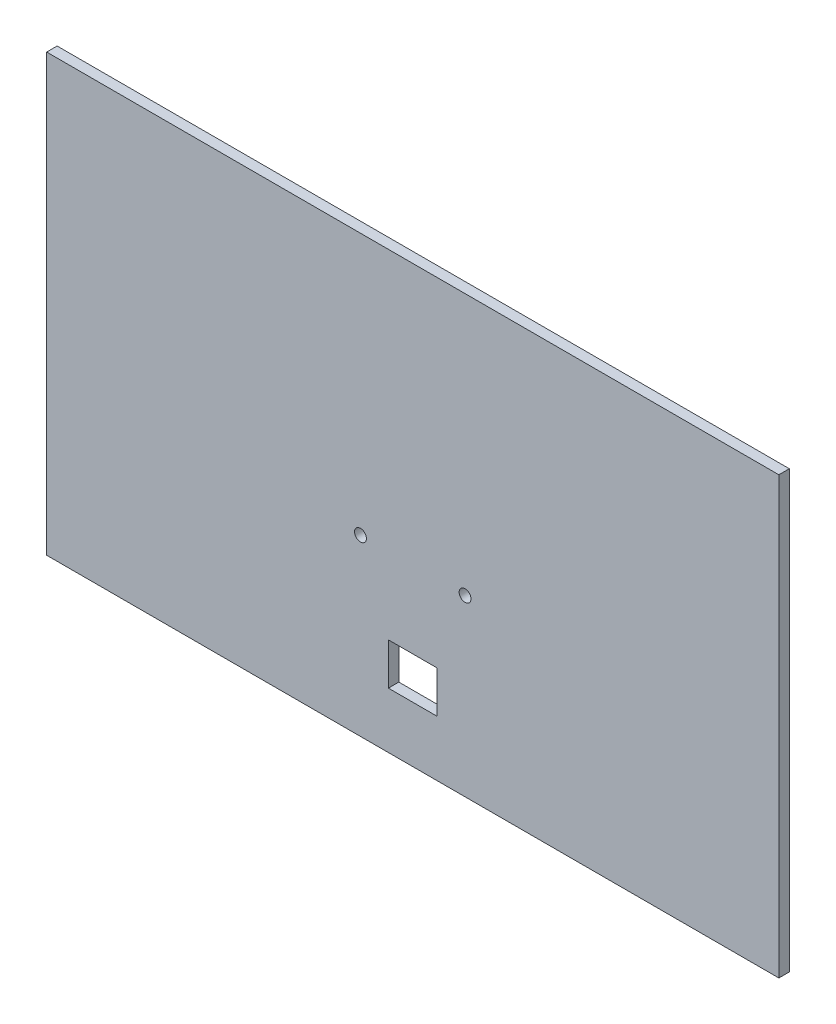
ISO-10303-21;
HEADER;
FILE_DESCRIPTION(('STEP AP214'),'2;1');
FILE_NAME('part.step','',(''),(''),'','','');
FILE_SCHEMA(('AUTOMOTIVE_DESIGN { 1 0 10303 214 1 1 1 1 }'));
ENDSEC;
DATA;
#1=APPLICATION_CONTEXT('core data for automotive mechanical design processes');
#2=APPLICATION_PROTOCOL_DEFINITION('international standard','automotive_design',2000,#1);
#3=PRODUCT_CONTEXT('',#1,'mechanical');
#4=PRODUCT('Part','Part','',(#3));
#5=PRODUCT_RELATED_PRODUCT_CATEGORY('part','',(#4));
#6=PRODUCT_DEFINITION_FORMATION('','',#4);
#7=PRODUCT_DEFINITION_CONTEXT('part definition',#1,'design');
#8=PRODUCT_DEFINITION('design','',#6,#7);
#9=PRODUCT_DEFINITION_SHAPE('','',#8);
#10=(LENGTH_UNIT() NAMED_UNIT(*) SI_UNIT(.MILLI.,.METRE.));
#11=(NAMED_UNIT(*) PLANE_ANGLE_UNIT() SI_UNIT($,.RADIAN.));
#12=(NAMED_UNIT(*) SI_UNIT($,.STERADIAN.) SOLID_ANGLE_UNIT());
#13=UNCERTAINTY_MEASURE_WITH_UNIT(LENGTH_MEASURE(1.E-05),#10,'distance_accuracy_value','');
#14=(GEOMETRIC_REPRESENTATION_CONTEXT(3) GLOBAL_UNCERTAINTY_ASSIGNED_CONTEXT((#13)) GLOBAL_UNIT_ASSIGNED_CONTEXT((#10,
#11,#12)) REPRESENTATION_CONTEXT('',''));
#15=CARTESIAN_POINT('',(0.,0.,0.));
#16=DIRECTION('',(0.,0.,1.));
#17=DIRECTION('',(1.,0.,0.));
#18=AXIS2_PLACEMENT_3D('',#15,#16,#17);
#19=CARTESIAN_POINT('',(0.,0.,3.));
#20=DIRECTION('',(0.,0.,-1.));
#21=DIRECTION('',(-1.,0.,0.));
#22=AXIS2_PLACEMENT_3D('',#19,#20,#21);
#23=PLANE('',#22);
#24=DIRECTION('',(0.,-1.,0.));
#25=VECTOR('',#24,1.);
#26=CARTESIAN_POINT('',(-105.,0.,3.));
#27=LINE('',#26,#25);
#28=CARTESIAN_POINT('',(-105.,125.,3.));
#29=VERTEX_POINT('',#28);
#30=CARTESIAN_POINT('',(-105.,0.,3.));
#31=VERTEX_POINT('',#30);
#32=EDGE_CURVE('E155',#29,#31,#27,.T.);
#33=ORIENTED_EDGE('',*,*,#32,.T.);
#34=DIRECTION('',(1.,0.,0.));
#35=VECTOR('',#34,1.);
#36=CARTESIAN_POINT('',(-105.,0.,3.));
#37=LINE('',#36,#35);
#38=CARTESIAN_POINT('',(105.,0.,3.));
#39=VERTEX_POINT('',#38);
#40=EDGE_CURVE('E154',#31,#39,#37,.T.);
#41=ORIENTED_EDGE('',*,*,#40,.T.);
#42=DIRECTION('',(0.,1.,0.));
#43=VECTOR('',#42,1.);
#44=CARTESIAN_POINT('',(105.,0.,3.));
#45=LINE('',#44,#43);
#46=CARTESIAN_POINT('',(105.,125.,3.));
#47=VERTEX_POINT('',#46);
#48=EDGE_CURVE('E158',#39,#47,#45,.T.);
#49=ORIENTED_EDGE('',*,*,#48,.T.);
#50=DIRECTION('',(-1.,0.,0.));
#51=VECTOR('',#50,1.);
#52=CARTESIAN_POINT('',(-105.,125.,3.));
#53=LINE('',#52,#51);
#54=EDGE_CURVE('E159',#47,#29,#53,.T.);
#55=ORIENTED_EDGE('',*,*,#54,.T.);
#56=EDGE_LOOP('',(#33,#41,#49,#55));
#57=FACE_BOUND('',#56,.T.);
#58=CARTESIAN_POINT('',(-15.,50.,3.));
#59=DIRECTION('',(0.,0.,1.));
#60=DIRECTION('',(1.,0.,0.));
#61=AXIS2_PLACEMENT_3D('',#58,#59,#60);
#62=CIRCLE('',#61,1.7);
#63=CARTESIAN_POINT('',(-13.3,50.,3.));
#64=VERTEX_POINT('',#63);
#65=EDGE_CURVE('E119',#64,#64,#62,.T.);
#66=ORIENTED_EDGE('',*,*,#65,.F.);
#67=EDGE_LOOP('',(#66));
#68=FACE_BOUND('',#67,.T.);
#69=CARTESIAN_POINT('',(15.,50.,3.));
#70=DIRECTION('',(0.,0.,1.));
#71=DIRECTION('',(1.,0.,0.));
#72=AXIS2_PLACEMENT_3D('',#69,#70,#71);
#73=CIRCLE('',#72,1.7);
#74=CARTESIAN_POINT('',(16.7,50.,3.));
#75=VERTEX_POINT('',#74);
#76=EDGE_CURVE('E139',#75,#75,#73,.T.);
#77=ORIENTED_EDGE('',*,*,#76,.F.);
#78=EDGE_LOOP('',(#77));
#79=FACE_BOUND('',#78,.T.);
#80=DIRECTION('',(0.,-1.,0.));
#81=VECTOR('',#80,1.);
#82=CARTESIAN_POINT('',(-7.,16.,3.));
#83=LINE('',#82,#81);
#84=CARTESIAN_POINT('',(-7.,28.,3.));
#85=VERTEX_POINT('',#84);
#86=CARTESIAN_POINT('',(-7.,16.,3.));
#87=VERTEX_POINT('',#86);
#88=EDGE_CURVE('E102',#85,#87,#83,.T.);
#89=ORIENTED_EDGE('',*,*,#88,.F.);
#90=DIRECTION('',(-1.,0.,0.));
#91=VECTOR('',#90,1.);
#92=CARTESIAN_POINT('',(-7.,28.,3.));
#93=LINE('',#92,#91);
#94=CARTESIAN_POINT('',(7.,28.,3.));
#95=VERTEX_POINT('',#94);
#96=EDGE_CURVE('E127',#95,#85,#93,.T.);
#97=ORIENTED_EDGE('',*,*,#96,.F.);
#98=DIRECTION('',(0.,1.,0.));
#99=VECTOR('',#98,1.);
#100=CARTESIAN_POINT('',(7.,16.,3.));
#101=LINE('',#100,#99);
#102=CARTESIAN_POINT('',(7.,16.,3.));
#103=VERTEX_POINT('',#102);
#104=EDGE_CURVE('E122',#103,#95,#101,.T.);
#105=ORIENTED_EDGE('',*,*,#104,.F.);
#106=DIRECTION('',(1.,0.,0.));
#107=VECTOR('',#106,1.);
#108=CARTESIAN_POINT('',(-7.,16.,3.));
#109=LINE('',#108,#107);
#110=EDGE_CURVE('E115',#87,#103,#109,.T.);
#111=ORIENTED_EDGE('',*,*,#110,.F.);
#112=EDGE_LOOP('',(#89,#97,#105,#111));
#113=FACE_BOUND('',#112,.T.);
#114=ADVANCED_FACE('F39',(#57,#68,#79,#113),#23,.F.);
#115=CARTESIAN_POINT('',(0.,0.,0.));
#116=DIRECTION('',(0.,0.,-1.));
#117=DIRECTION('',(-1.,0.,0.));
#118=AXIS2_PLACEMENT_3D('',#115,#116,#117);
#119=PLANE('',#118);
#120=CARTESIAN_POINT('',(15.,50.,0.));
#121=DIRECTION('',(0.,0.,1.));
#122=DIRECTION('',(1.,0.,0.));
#123=AXIS2_PLACEMENT_3D('',#120,#121,#122);
#124=CIRCLE('',#123,1.7);
#125=CARTESIAN_POINT('',(16.7,50.,0.));
#126=VERTEX_POINT('',#125);
#127=EDGE_CURVE('E145',#126,#126,#124,.T.);
#128=ORIENTED_EDGE('',*,*,#127,.T.);
#129=EDGE_LOOP('',(#128));
#130=FACE_BOUND('',#129,.T.);
#131=CARTESIAN_POINT('',(-15.,50.,0.));
#132=DIRECTION('',(0.,0.,1.));
#133=DIRECTION('',(1.,0.,0.));
#134=AXIS2_PLACEMENT_3D('',#131,#132,#133);
#135=CIRCLE('',#134,1.7);
#136=CARTESIAN_POINT('',(-13.3,50.,0.));
#137=VERTEX_POINT('',#136);
#138=EDGE_CURVE('E150',#137,#137,#135,.T.);
#139=ORIENTED_EDGE('',*,*,#138,.T.);
#140=EDGE_LOOP('',(#139));
#141=FACE_BOUND('',#140,.T.);
#142=DIRECTION('',(0.,-1.,0.));
#143=VECTOR('',#142,1.);
#144=CARTESIAN_POINT('',(-105.,0.,0.));
#145=LINE('',#144,#143);
#146=CARTESIAN_POINT('',(-105.,125.,0.));
#147=VERTEX_POINT('',#146);
#148=CARTESIAN_POINT('',(-105.,0.,0.));
#149=VERTEX_POINT('',#148);
#150=EDGE_CURVE('E141',#147,#149,#145,.T.);
#151=ORIENTED_EDGE('',*,*,#150,.F.);
#152=DIRECTION('',(-1.,0.,0.));
#153=VECTOR('',#152,1.);
#154=CARTESIAN_POINT('',(-105.,125.,0.));
#155=LINE('',#154,#153);
#156=CARTESIAN_POINT('',(105.,125.,0.));
#157=VERTEX_POINT('',#156);
#158=EDGE_CURVE('E156',#157,#147,#155,.T.);
#159=ORIENTED_EDGE('',*,*,#158,.F.);
#160=DIRECTION('',(0.,1.,0.));
#161=VECTOR('',#160,1.);
#162=CARTESIAN_POINT('',(105.,0.,0.));
#163=LINE('',#162,#161);
#164=CARTESIAN_POINT('',(105.,0.,0.));
#165=VERTEX_POINT('',#164);
#166=EDGE_CURVE('E170',#165,#157,#163,.T.);
#167=ORIENTED_EDGE('',*,*,#166,.F.);
#168=DIRECTION('',(1.,0.,0.));
#169=VECTOR('',#168,1.);
#170=CARTESIAN_POINT('',(-105.,0.,0.));
#171=LINE('',#170,#169);
#172=EDGE_CURVE('E164',#149,#165,#171,.T.);
#173=ORIENTED_EDGE('',*,*,#172,.F.);
#174=EDGE_LOOP('',(#151,#159,#167,#173));
#175=FACE_BOUND('',#174,.T.);
#176=DIRECTION('',(-1.,0.,0.));
#177=VECTOR('',#176,1.);
#178=CARTESIAN_POINT('',(-7.,28.,0.));
#179=LINE('',#178,#177);
#180=CARTESIAN_POINT('',(7.,28.,0.));
#181=VERTEX_POINT('',#180);
#182=CARTESIAN_POINT('',(-7.,28.,0.));
#183=VERTEX_POINT('',#182);
#184=EDGE_CURVE('E114',#181,#183,#179,.T.);
#185=ORIENTED_EDGE('',*,*,#184,.T.);
#186=DIRECTION('',(0.,-1.,0.));
#187=VECTOR('',#186,1.);
#188=CARTESIAN_POINT('',(-7.,16.,0.));
#189=LINE('',#188,#187);
#190=CARTESIAN_POINT('',(-7.,16.,0.));
#191=VERTEX_POINT('',#190);
#192=EDGE_CURVE('E65',#183,#191,#189,.T.);
#193=ORIENTED_EDGE('',*,*,#192,.T.);
#194=DIRECTION('',(1.,0.,0.));
#195=VECTOR('',#194,1.);
#196=CARTESIAN_POINT('',(-7.,16.,0.));
#197=LINE('',#196,#195);
#198=CARTESIAN_POINT('',(7.,16.,0.));
#199=VERTEX_POINT('',#198);
#200=EDGE_CURVE('E117',#191,#199,#197,.T.);
#201=ORIENTED_EDGE('',*,*,#200,.T.);
#202=DIRECTION('',(0.,1.,0.));
#203=VECTOR('',#202,1.);
#204=CARTESIAN_POINT('',(7.,16.,0.));
#205=LINE('',#204,#203);
#206=EDGE_CURVE('E135',#199,#181,#205,.T.);
#207=ORIENTED_EDGE('',*,*,#206,.T.);
#208=EDGE_LOOP('',(#185,#193,#201,#207));
#209=FACE_BOUND('',#208,.T.);
#210=ADVANCED_FACE('F183',(#130,#141,#175,#209),#119,.T.);
#211=CARTESIAN_POINT('',(-105.,0.,3.));
#212=DIRECTION('',(1.,0.,0.));
#213=DIRECTION('',(0.,0.,-1.));
#214=AXIS2_PLACEMENT_3D('',#211,#212,#213);
#215=PLANE('',#214);
#216=ORIENTED_EDGE('',*,*,#150,.T.);
#217=DIRECTION('',(0.,0.,-1.));
#218=VECTOR('',#217,1.);
#219=CARTESIAN_POINT('',(-105.,0.,3.));
#220=LINE('',#219,#218);
#221=EDGE_CURVE('E11',#31,#149,#220,.T.);
#222=ORIENTED_EDGE('',*,*,#221,.F.);
#223=ORIENTED_EDGE('',*,*,#32,.F.);
#224=DIRECTION('',(0.,0.,-1.));
#225=VECTOR('',#224,1.);
#226=CARTESIAN_POINT('',(-105.,125.,3.));
#227=LINE('',#226,#225);
#228=EDGE_CURVE('E165',#29,#147,#227,.T.);
#229=ORIENTED_EDGE('',*,*,#228,.T.);
#230=EDGE_LOOP('',(#216,#222,#223,#229));
#231=FACE_BOUND('',#230,.T.);
#232=ADVANCED_FACE('F41',(#231),#215,.F.);
#233=CARTESIAN_POINT('',(-105.,0.,3.));
#234=DIRECTION('',(0.,1.,0.));
#235=DIRECTION('',(0.,0.,1.));
#236=AXIS2_PLACEMENT_3D('',#233,#234,#235);
#237=PLANE('',#236);
#238=ORIENTED_EDGE('',*,*,#172,.T.);
#239=DIRECTION('',(0.,0.,-1.));
#240=VECTOR('',#239,1.);
#241=CARTESIAN_POINT('',(105.,0.,3.));
#242=LINE('',#241,#240);
#243=EDGE_CURVE('E50',#39,#165,#242,.T.);
#244=ORIENTED_EDGE('',*,*,#243,.F.);
#245=ORIENTED_EDGE('',*,*,#40,.F.);
#246=ORIENTED_EDGE('',*,*,#221,.T.);
#247=EDGE_LOOP('',(#238,#244,#245,#246));
#248=FACE_BOUND('',#247,.T.);
#249=ADVANCED_FACE('F198',(#248),#237,.F.);
#250=CARTESIAN_POINT('',(105.,0.,3.));
#251=DIRECTION('',(-1.,0.,0.));
#252=DIRECTION('',(0.,0.,1.));
#253=AXIS2_PLACEMENT_3D('',#250,#251,#252);
#254=PLANE('',#253);
#255=ORIENTED_EDGE('',*,*,#166,.T.);
#256=DIRECTION('',(0.,0.,-1.));
#257=VECTOR('',#256,1.);
#258=CARTESIAN_POINT('',(105.,125.,3.));
#259=LINE('',#258,#257);
#260=EDGE_CURVE('E175',#47,#157,#259,.T.);
#261=ORIENTED_EDGE('',*,*,#260,.F.);
#262=ORIENTED_EDGE('',*,*,#48,.F.);
#263=ORIENTED_EDGE('',*,*,#243,.T.);
#264=EDGE_LOOP('',(#255,#261,#262,#263));
#265=FACE_BOUND('',#264,.T.);
#266=ADVANCED_FACE('F177',(#265),#254,.F.);
#267=CARTESIAN_POINT('',(-105.,125.,3.));
#268=DIRECTION('',(0.,-1.,0.));
#269=DIRECTION('',(0.,0.,-1.));
#270=AXIS2_PLACEMENT_3D('',#267,#268,#269);
#271=PLANE('',#270);
#272=ORIENTED_EDGE('',*,*,#158,.T.);
#273=ORIENTED_EDGE('',*,*,#228,.F.);
#274=ORIENTED_EDGE('',*,*,#54,.F.);
#275=ORIENTED_EDGE('',*,*,#260,.T.);
#276=EDGE_LOOP('',(#272,#273,#274,#275));
#277=FACE_BOUND('',#276,.T.);
#278=ADVANCED_FACE('F187',(#277),#271,.F.);
#279=CARTESIAN_POINT('',(-15.,50.,3.));
#280=DIRECTION('',(0.,0.,-1.));
#281=DIRECTION('',(-1.,0.,0.));
#282=AXIS2_PLACEMENT_3D('',#279,#280,#281);
#283=CYLINDRICAL_SURFACE('',#282,1.7);
#284=ORIENTED_EDGE('',*,*,#65,.T.);
#285=EDGE_LOOP('',(#284));
#286=FACE_BOUND('',#285,.T.);
#287=ORIENTED_EDGE('',*,*,#138,.F.);
#288=EDGE_LOOP('',(#287));
#289=FACE_BOUND('',#288,.T.);
#290=ADVANCED_FACE('F215',(#286,#289),#283,.F.);
#291=CARTESIAN_POINT('',(15.,50.,3.));
#292=DIRECTION('',(0.,0.,-1.));
#293=DIRECTION('',(-1.,0.,0.));
#294=AXIS2_PLACEMENT_3D('',#291,#292,#293);
#295=CYLINDRICAL_SURFACE('',#294,1.7);
#296=ORIENTED_EDGE('',*,*,#76,.T.);
#297=EDGE_LOOP('',(#296));
#298=FACE_BOUND('',#297,.T.);
#299=ORIENTED_EDGE('',*,*,#127,.F.);
#300=EDGE_LOOP('',(#299));
#301=FACE_BOUND('',#300,.T.);
#302=ADVANCED_FACE('F218',(#298,#301),#295,.F.);
#303=CARTESIAN_POINT('',(-7.,16.,3.));
#304=DIRECTION('',(1.,0.,0.));
#305=DIRECTION('',(0.,0.,-1.));
#306=AXIS2_PLACEMENT_3D('',#303,#304,#305);
#307=PLANE('',#306);
#308=ORIENTED_EDGE('',*,*,#192,.F.);
#309=DIRECTION('',(0.,0.,-1.));
#310=VECTOR('',#309,1.);
#311=CARTESIAN_POINT('',(-7.,28.,3.));
#312=LINE('',#311,#310);
#313=EDGE_CURVE('E107',#85,#183,#312,.T.);
#314=ORIENTED_EDGE('',*,*,#313,.F.);
#315=ORIENTED_EDGE('',*,*,#88,.T.);
#316=DIRECTION('',(0.,0.,-1.));
#317=VECTOR('',#316,1.);
#318=CARTESIAN_POINT('',(-7.,16.,3.));
#319=LINE('',#318,#317);
#320=EDGE_CURVE('E110',#87,#191,#319,.T.);
#321=ORIENTED_EDGE('',*,*,#320,.T.);
#322=EDGE_LOOP('',(#308,#314,#315,#321));
#323=FACE_BOUND('',#322,.T.);
#324=ADVANCED_FACE('F106',(#323),#307,.T.);
#325=CARTESIAN_POINT('',(-7.,16.,3.));
#326=DIRECTION('',(0.,1.,0.));
#327=DIRECTION('',(0.,0.,1.));
#328=AXIS2_PLACEMENT_3D('',#325,#326,#327);
#329=PLANE('',#328);
#330=ORIENTED_EDGE('',*,*,#200,.F.);
#331=ORIENTED_EDGE('',*,*,#320,.F.);
#332=ORIENTED_EDGE('',*,*,#110,.T.);
#333=DIRECTION('',(0.,0.,-1.));
#334=VECTOR('',#333,1.);
#335=CARTESIAN_POINT('',(7.,16.,3.));
#336=LINE('',#335,#334);
#337=EDGE_CURVE('E123',#103,#199,#336,.T.);
#338=ORIENTED_EDGE('',*,*,#337,.T.);
#339=EDGE_LOOP('',(#330,#331,#332,#338));
#340=FACE_BOUND('',#339,.T.);
#341=ADVANCED_FACE('F118',(#340),#329,.T.);
#342=CARTESIAN_POINT('',(7.,16.,3.));
#343=DIRECTION('',(-1.,0.,0.));
#344=DIRECTION('',(0.,0.,1.));
#345=AXIS2_PLACEMENT_3D('',#342,#343,#344);
#346=PLANE('',#345);
#347=ORIENTED_EDGE('',*,*,#206,.F.);
#348=ORIENTED_EDGE('',*,*,#337,.F.);
#349=ORIENTED_EDGE('',*,*,#104,.T.);
#350=DIRECTION('',(0.,0.,-1.));
#351=VECTOR('',#350,1.);
#352=CARTESIAN_POINT('',(7.,28.,3.));
#353=LINE('',#352,#351);
#354=EDGE_CURVE('E53',#95,#181,#353,.T.);
#355=ORIENTED_EDGE('',*,*,#354,.T.);
#356=EDGE_LOOP('',(#347,#348,#349,#355));
#357=FACE_BOUND('',#356,.T.);
#358=ADVANCED_FACE('F239',(#357),#346,.T.);
#359=CARTESIAN_POINT('',(-7.,28.,3.));
#360=DIRECTION('',(0.,-1.,0.));
#361=DIRECTION('',(0.,0.,-1.));
#362=AXIS2_PLACEMENT_3D('',#359,#360,#361);
#363=PLANE('',#362);
#364=ORIENTED_EDGE('',*,*,#184,.F.);
#365=ORIENTED_EDGE('',*,*,#354,.F.);
#366=ORIENTED_EDGE('',*,*,#96,.T.);
#367=ORIENTED_EDGE('',*,*,#313,.T.);
#368=EDGE_LOOP('',(#364,#365,#366,#367));
#369=FACE_BOUND('',#368,.T.);
#370=ADVANCED_FACE('F245',(#369),#363,.T.);
#371=CLOSED_SHELL('',(#114,#210,#232,#249,#266,#278,#290,#302,#324,#341,#358,#370));
#372=MANIFOLD_SOLID_BREP('B2',#371);
#373=ADVANCED_BREP_SHAPE_REPRESENTATION('',(#18,#372),#14);
#374=SHAPE_DEFINITION_REPRESENTATION(#9,#373);
ENDSEC;
END-ISO-10303-21;
